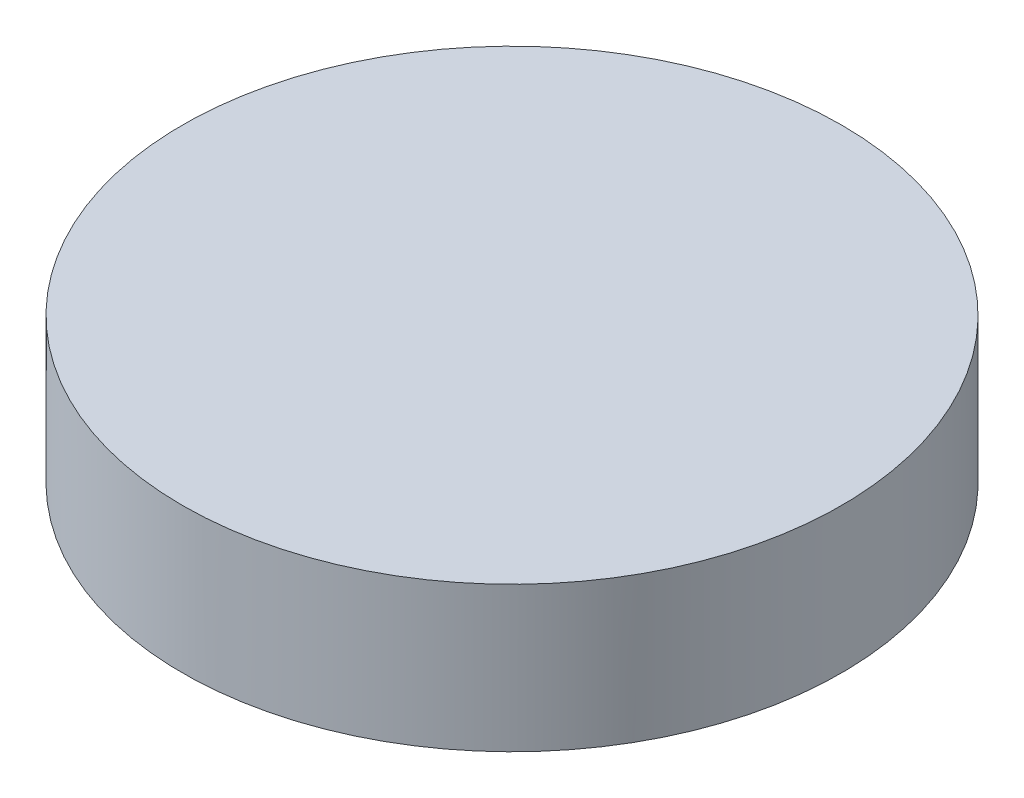
ISO-10303-21;
HEADER;
FILE_DESCRIPTION(('STEP AP214'),'2;1');
FILE_NAME('part.step','',(''),(''),'','','');
FILE_SCHEMA(('AUTOMOTIVE_DESIGN { 1 0 10303 214 1 1 1 1 }'));
ENDSEC;
DATA;
#1=APPLICATION_CONTEXT('core data for automotive mechanical design processes');
#2=APPLICATION_PROTOCOL_DEFINITION('international standard','automotive_design',2000,#1);
#3=PRODUCT_CONTEXT('',#1,'mechanical');
#4=PRODUCT('Part','Part','',(#3));
#5=PRODUCT_RELATED_PRODUCT_CATEGORY('part','',(#4));
#6=PRODUCT_DEFINITION_FORMATION('','',#4);
#7=PRODUCT_DEFINITION_CONTEXT('part definition',#1,'design');
#8=PRODUCT_DEFINITION('design','',#6,#7);
#9=PRODUCT_DEFINITION_SHAPE('','',#8);
#10=(LENGTH_UNIT() NAMED_UNIT(*) SI_UNIT(.MILLI.,.METRE.));
#11=(NAMED_UNIT(*) PLANE_ANGLE_UNIT() SI_UNIT($,.RADIAN.));
#12=(NAMED_UNIT(*) SI_UNIT($,.STERADIAN.) SOLID_ANGLE_UNIT());
#13=UNCERTAINTY_MEASURE_WITH_UNIT(LENGTH_MEASURE(1.E-05),#10,'distance_accuracy_value','');
#14=(GEOMETRIC_REPRESENTATION_CONTEXT(3) GLOBAL_UNCERTAINTY_ASSIGNED_CONTEXT((#13)) GLOBAL_UNIT_ASSIGNED_CONTEXT((#10,
#11,#12)) REPRESENTATION_CONTEXT('',''));
#15=CARTESIAN_POINT('',(0.,0.,0.));
#16=DIRECTION('',(0.,0.,1.));
#17=DIRECTION('',(1.,0.,0.));
#18=AXIS2_PLACEMENT_3D('',#15,#16,#17);
#19=CARTESIAN_POINT('',(0.,56.65,0.));
#20=DIRECTION('',(0.,-1.,0.));
#21=DIRECTION('',(0.,0.,-1.));
#22=AXIS2_PLACEMENT_3D('',#19,#20,#21);
#23=PLANE('',#22);
#24=CARTESIAN_POINT('',(0.,56.65,0.));
#25=DIRECTION('',(0.,-1.,0.));
#26=DIRECTION('',(0.,0.,-1.));
#27=AXIS2_PLACEMENT_3D('',#24,#25,#26);
#28=CIRCLE('',#27,13.63);
#29=CARTESIAN_POINT('',(0.,56.65,-13.63));
#30=VERTEX_POINT('',#29);
#31=EDGE_CURVE('E11',#30,#30,#28,.T.);
#32=ORIENTED_EDGE('',*,*,#31,.T.);
#33=EDGE_LOOP('',(#32));
#34=FACE_BOUND('',#33,.T.);
#35=ADVANCED_FACE('F16',(#34),#23,.T.);
#36=CARTESIAN_POINT('',(0.,62.65,0.));
#37=DIRECTION('',(0.,-1.,0.));
#38=DIRECTION('',(0.,0.,-1.));
#39=AXIS2_PLACEMENT_3D('',#36,#37,#38);
#40=PLANE('',#39);
#41=CARTESIAN_POINT('',(0.,62.65,0.));
#42=DIRECTION('',(0.,-1.,0.));
#43=DIRECTION('',(0.,0.,-1.));
#44=AXIS2_PLACEMENT_3D('',#41,#42,#43);
#45=CIRCLE('',#44,13.63);
#46=CARTESIAN_POINT('',(0.,62.65,13.63));
#47=VERTEX_POINT('',#46);
#48=EDGE_CURVE('E19',#47,#47,#45,.T.);
#49=ORIENTED_EDGE('',*,*,#48,.F.);
#50=EDGE_LOOP('',(#49));
#51=FACE_BOUND('',#50,.T.);
#52=ADVANCED_FACE('F53',(#51),#40,.F.);
#53=CARTESIAN_POINT('',(0.,62.65,0.));
#54=DIRECTION('',(0.,-1.,0.));
#55=DIRECTION('',(0.,0.,-1.));
#56=AXIS2_PLACEMENT_3D('',#53,#54,#55);
#57=CYLINDRICAL_SURFACE('',#56,13.63);
#58=ORIENTED_EDGE('',*,*,#31,.F.);
#59=EDGE_LOOP('',(#58));
#60=FACE_BOUND('',#59,.T.);
#61=ORIENTED_EDGE('',*,*,#48,.T.);
#62=EDGE_LOOP('',(#61));
#63=FACE_BOUND('',#62,.T.);
#64=ADVANCED_FACE('F40',(#60,#63),#57,.T.);
#65=CLOSED_SHELL('',(#35,#52,#64));
#66=MANIFOLD_SOLID_BREP('B1',#65);
#67=ADVANCED_BREP_SHAPE_REPRESENTATION('',(#18,#66),#14);
#68=SHAPE_DEFINITION_REPRESENTATION(#9,#67);
ENDSEC;
END-ISO-10303-21;
